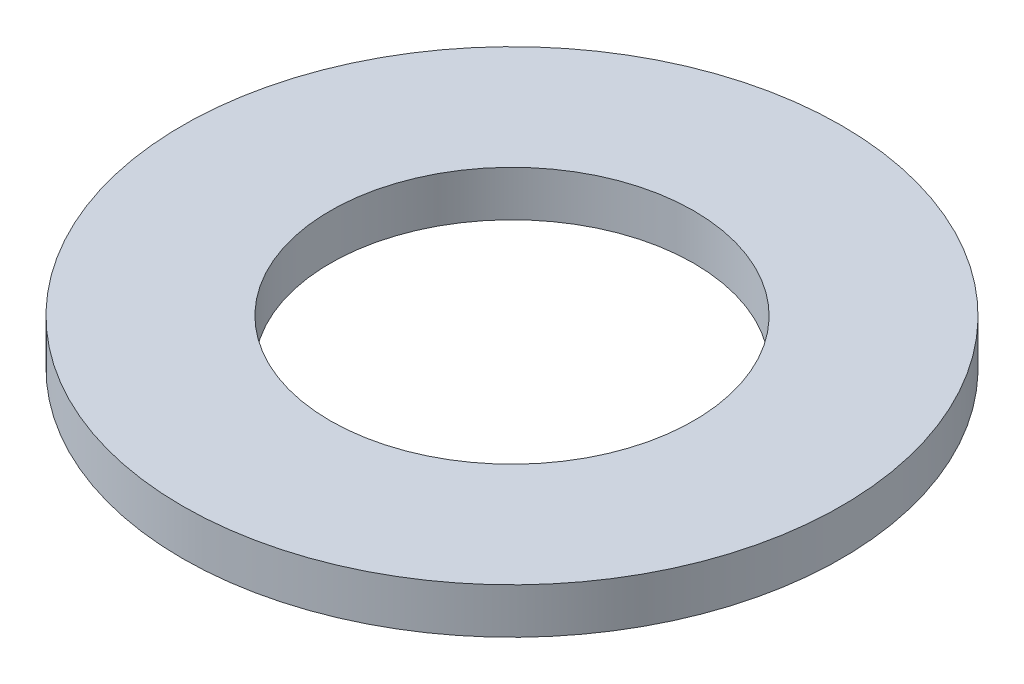
ISO-10303-21;
HEADER;
FILE_DESCRIPTION(('STEP AP214'),'2;1');
FILE_NAME('part.step','',(''),(''),'','','');
FILE_SCHEMA(('AUTOMOTIVE_DESIGN { 1 0 10303 214 1 1 1 1 }'));
ENDSEC;
DATA;
#1=APPLICATION_CONTEXT('core data for automotive mechanical design processes');
#2=APPLICATION_PROTOCOL_DEFINITION('international standard','automotive_design',2000,#1);
#3=PRODUCT_CONTEXT('',#1,'mechanical');
#4=PRODUCT('Part','Part','',(#3));
#5=PRODUCT_RELATED_PRODUCT_CATEGORY('part','',(#4));
#6=PRODUCT_DEFINITION_FORMATION('','',#4);
#7=PRODUCT_DEFINITION_CONTEXT('part definition',#1,'design');
#8=PRODUCT_DEFINITION('design','',#6,#7);
#9=PRODUCT_DEFINITION_SHAPE('','',#8);
#10=(LENGTH_UNIT() NAMED_UNIT(*) SI_UNIT(.MILLI.,.METRE.));
#11=(NAMED_UNIT(*) PLANE_ANGLE_UNIT() SI_UNIT($,.RADIAN.));
#12=(NAMED_UNIT(*) SI_UNIT($,.STERADIAN.) SOLID_ANGLE_UNIT());
#13=UNCERTAINTY_MEASURE_WITH_UNIT(LENGTH_MEASURE(1.E-05),#10,'distance_accuracy_value','');
#14=(GEOMETRIC_REPRESENTATION_CONTEXT(3) GLOBAL_UNCERTAINTY_ASSIGNED_CONTEXT((#13)) GLOBAL_UNIT_ASSIGNED_CONTEXT((#10,
#11,#12)) REPRESENTATION_CONTEXT('',''));
#15=CARTESIAN_POINT('',(0.,0.,0.));
#16=DIRECTION('',(0.,0.,1.));
#17=DIRECTION('',(1.,0.,0.));
#18=AXIS2_PLACEMENT_3D('',#15,#16,#17);
#19=CARTESIAN_POINT('',(0.,2.,0.));
#20=DIRECTION('',(0.,1.,0.));
#21=DIRECTION('',(0.,0.,1.));
#22=AXIS2_PLACEMENT_3D('',#19,#20,#21);
#23=PLANE('',#22);
#24=CARTESIAN_POINT('',(0.,2.,0.));
#25=DIRECTION('',(0.,1.,0.));
#26=DIRECTION('',(0.,0.,1.));
#27=AXIS2_PLACEMENT_3D('',#24,#25,#26);
#28=CIRCLE('',#27,14.5);
#29=CARTESIAN_POINT('',(0.,2.,14.5));
#30=VERTEX_POINT('',#29);
#31=EDGE_CURVE('E10',#30,#30,#28,.T.);
#32=ORIENTED_EDGE('',*,*,#31,.T.);
#33=EDGE_LOOP('',(#32));
#34=FACE_BOUND('',#33,.T.);
#35=CARTESIAN_POINT('',(0.,2.,0.));
#36=DIRECTION('',(0.,1.,0.));
#37=DIRECTION('',(0.,0.,1.));
#38=AXIS2_PLACEMENT_3D('',#35,#36,#37);
#39=CIRCLE('',#38,8.);
#40=CARTESIAN_POINT('',(0.,2.,8.));
#41=VERTEX_POINT('',#40);
#42=EDGE_CURVE('E45',#41,#41,#39,.T.);
#43=ORIENTED_EDGE('',*,*,#42,.F.);
#44=EDGE_LOOP('',(#43));
#45=FACE_BOUND('',#44,.T.);
#46=ADVANCED_FACE('F34',(#34,#45),#23,.T.);
#47=CARTESIAN_POINT('',(0.,0.,0.));
#48=DIRECTION('',(0.,1.,0.));
#49=DIRECTION('',(0.,0.,1.));
#50=AXIS2_PLACEMENT_3D('',#47,#48,#49);
#51=PLANE('',#50);
#52=CARTESIAN_POINT('',(0.,0.,0.));
#53=DIRECTION('',(0.,1.,0.));
#54=DIRECTION('',(0.,0.,1.));
#55=AXIS2_PLACEMENT_3D('',#52,#53,#54);
#56=CIRCLE('',#55,14.5);
#57=CARTESIAN_POINT('',(0.,0.,14.5));
#58=VERTEX_POINT('',#57);
#59=EDGE_CURVE('E38',#58,#58,#56,.T.);
#60=ORIENTED_EDGE('',*,*,#59,.F.);
#61=EDGE_LOOP('',(#60));
#62=FACE_BOUND('',#61,.T.);
#63=CARTESIAN_POINT('',(0.,0.,0.));
#64=DIRECTION('',(0.,1.,0.));
#65=DIRECTION('',(0.,0.,1.));
#66=AXIS2_PLACEMENT_3D('',#63,#64,#65);
#67=CIRCLE('',#66,8.);
#68=CARTESIAN_POINT('',(0.,0.,8.));
#69=VERTEX_POINT('',#68);
#70=EDGE_CURVE('E47',#69,#69,#67,.T.);
#71=ORIENTED_EDGE('',*,*,#70,.T.);
#72=EDGE_LOOP('',(#71));
#73=FACE_BOUND('',#72,.T.);
#74=ADVANCED_FACE('F57',(#62,#73),#51,.F.);
#75=CARTESIAN_POINT('',(0.,2.,0.));
#76=DIRECTION('',(0.,-1.,0.));
#77=DIRECTION('',(0.,0.,-1.));
#78=AXIS2_PLACEMENT_3D('',#75,#76,#77);
#79=CYLINDRICAL_SURFACE('',#78,14.5);
#80=ORIENTED_EDGE('',*,*,#31,.F.);
#81=EDGE_LOOP('',(#80));
#82=FACE_BOUND('',#81,.T.);
#83=ORIENTED_EDGE('',*,*,#59,.T.);
#84=EDGE_LOOP('',(#83));
#85=FACE_BOUND('',#84,.T.);
#86=ADVANCED_FACE('F36',(#82,#85),#79,.T.);
#87=CARTESIAN_POINT('',(0.,2.,0.));
#88=DIRECTION('',(0.,-1.,0.));
#89=DIRECTION('',(0.,0.,-1.));
#90=AXIS2_PLACEMENT_3D('',#87,#88,#89);
#91=CYLINDRICAL_SURFACE('',#90,8.);
#92=ORIENTED_EDGE('',*,*,#42,.T.);
#93=EDGE_LOOP('',(#92));
#94=FACE_BOUND('',#93,.T.);
#95=ORIENTED_EDGE('',*,*,#70,.F.);
#96=EDGE_LOOP('',(#95));
#97=FACE_BOUND('',#96,.T.);
#98=ADVANCED_FACE('F53',(#94,#97),#91,.F.);
#99=CLOSED_SHELL('',(#46,#74,#86,#98));
#100=MANIFOLD_SOLID_BREP('B2',#99);
#101=ADVANCED_BREP_SHAPE_REPRESENTATION('',(#18,#100),#14);
#102=SHAPE_DEFINITION_REPRESENTATION(#9,#101);
ENDSEC;
END-ISO-10303-21;
